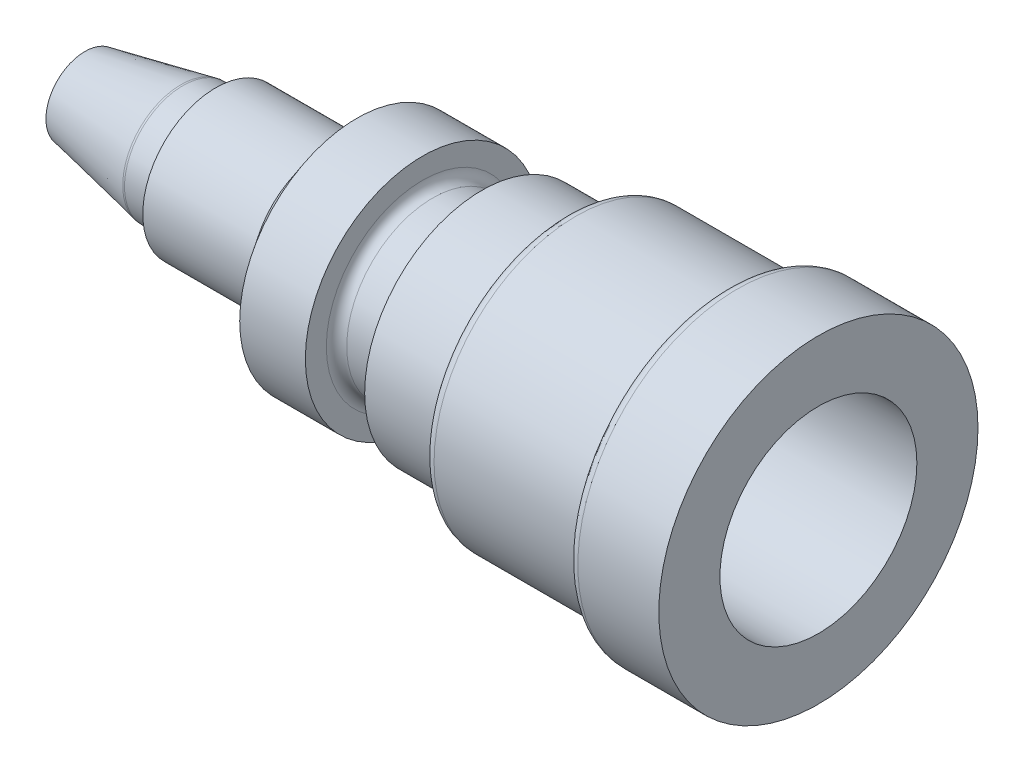
ISO-10303-21;
HEADER;
FILE_DESCRIPTION(('STEP AP214'),'2;1');
FILE_NAME('part.step','',(''),(''),'','','');
FILE_SCHEMA(('AUTOMOTIVE_DESIGN { 1 0 10303 214 1 1 1 1 }'));
ENDSEC;
DATA;
#1=APPLICATION_CONTEXT('core data for automotive mechanical design processes');
#2=APPLICATION_PROTOCOL_DEFINITION('international standard','automotive_design',2000,#1);
#3=PRODUCT_CONTEXT('',#1,'mechanical');
#4=PRODUCT('Part','Part','',(#3));
#5=PRODUCT_RELATED_PRODUCT_CATEGORY('part','',(#4));
#6=PRODUCT_DEFINITION_FORMATION('','',#4);
#7=PRODUCT_DEFINITION_CONTEXT('part definition',#1,'design');
#8=PRODUCT_DEFINITION('design','',#6,#7);
#9=PRODUCT_DEFINITION_SHAPE('','',#8);
#10=(LENGTH_UNIT() NAMED_UNIT(*) SI_UNIT(.MILLI.,.METRE.));
#11=(NAMED_UNIT(*) PLANE_ANGLE_UNIT() SI_UNIT($,.RADIAN.));
#12=(NAMED_UNIT(*) SI_UNIT($,.STERADIAN.) SOLID_ANGLE_UNIT());
#13=UNCERTAINTY_MEASURE_WITH_UNIT(LENGTH_MEASURE(1.E-05),#10,'distance_accuracy_value','');
#14=(GEOMETRIC_REPRESENTATION_CONTEXT(3) GLOBAL_UNCERTAINTY_ASSIGNED_CONTEXT((#13)) GLOBAL_UNIT_ASSIGNED_CONTEXT((#10,
#11,#12)) REPRESENTATION_CONTEXT('',''));
#15=CARTESIAN_POINT('',(0.,0.,0.));
#16=DIRECTION('',(0.,0.,1.));
#17=DIRECTION('',(1.,0.,0.));
#18=AXIS2_PLACEMENT_3D('',#15,#16,#17);
#19=CARTESIAN_POINT('',(-13.0082247191011,0.,-4.37206105171908));
#20=DIRECTION('',(-1.,0.,0.));
#21=DIRECTION('',(0.,0.,1.));
#22=AXIS2_PLACEMENT_3D('',#19,#20,#21);
#23=PLANE('',#22);
#24=CARTESIAN_POINT('',(-13.0082247191011,0.,0.));
#25=DIRECTION('',(1.,0.,0.));
#26=DIRECTION('',(0.,0.,-1.));
#27=AXIS2_PLACEMENT_3D('',#24,#25,#26);
#28=CIRCLE('',#27,4.37206105171908);
#29=CARTESIAN_POINT('',(-13.0082247191011,0.,-4.37206105171908));
#30=VERTEX_POINT('',#29);
#31=EDGE_CURVE('E10',#30,#30,#28,.T.);
#32=ORIENTED_EDGE('',*,*,#31,.T.);
#33=EDGE_LOOP('',(#32));
#34=FACE_BOUND('',#33,.T.);
#35=CARTESIAN_POINT('',(-13.0082247191011,0.,0.));
#36=DIRECTION('',(1.,0.,0.));
#37=DIRECTION('',(0.,0.,-1.));
#38=AXIS2_PLACEMENT_3D('',#35,#36,#37);
#39=CIRCLE('',#38,5.461);
#40=CARTESIAN_POINT('',(-13.0082247191011,0.,-5.461));
#41=VERTEX_POINT('',#40);
#42=EDGE_CURVE('E125',#41,#41,#39,.T.);
#43=ORIENTED_EDGE('',*,*,#42,.F.);
#44=EDGE_LOOP('',(#43));
#45=FACE_BOUND('',#44,.T.);
#46=ADVANCED_FACE('F42',(#34,#45),#23,.T.);
#47=CARTESIAN_POINT('',(32.0676997752809,0.,0.));
#48=DIRECTION('',(1.,0.,0.));
#49=DIRECTION('',(0.,0.,-1.));
#50=AXIS2_PLACEMENT_3D('',#47,#48,#49);
#51=CYLINDRICAL_SURFACE('',#50,4.37206105171908);
#52=CARTESIAN_POINT('',(-15.4629745923401,0.,0.));
#53=DIRECTION('',(1.,0.,0.));
#54=DIRECTION('',(0.,0.,-1.));
#55=AXIS2_PLACEMENT_3D('',#52,#53,#54);
#56=CIRCLE('',#55,4.37206105171908);
#57=CARTESIAN_POINT('',(-15.4629745923401,0.,-4.37206105171908));
#58=VERTEX_POINT('',#57);
#59=EDGE_CURVE('E50',#58,#58,#56,.T.);
#60=ORIENTED_EDGE('',*,*,#59,.T.);
#61=EDGE_LOOP('',(#60));
#62=FACE_BOUND('',#61,.T.);
#63=ORIENTED_EDGE('',*,*,#31,.F.);
#64=EDGE_LOOP('',(#63));
#65=FACE_BOUND('',#64,.T.);
#66=ADVANCED_FACE('F181',(#62,#65),#51,.T.);
#67=CARTESIAN_POINT('',(-15.4629745923401,0.,0.));
#68=DIRECTION('',(1.,0.,0.));
#69=DIRECTION('',(0.,0.,-1.));
#70=AXIS2_PLACEMENT_3D('',#67,#68,#69);
#71=TOROIDAL_SURFACE('',#70,3.61006105171908,0.762);
#72=CARTESIAN_POINT('',(-15.612883129274,0.,0.));
#73=DIRECTION('',(1.,0.,0.));
#74=DIRECTION('',(0.,0.,-1.));
#75=AXIS2_PLACEMENT_3D('',#72,#73,#74);
#76=CIRCLE('',#75,4.3571697657322);
#77=CARTESIAN_POINT('',(-15.612883129274,0.,-4.3571697657322));
#78=VERTEX_POINT('',#77);
#79=EDGE_CURVE('E55',#78,#78,#76,.T.);
#80=ORIENTED_EDGE('',*,*,#79,.T.);
#81=EDGE_LOOP('',(#80));
#82=FACE_BOUND('',#81,.T.);
#83=ORIENTED_EDGE('',*,*,#59,.F.);
#84=EDGE_LOOP('',(#83));
#85=FACE_BOUND('',#84,.T.);
#86=ADVANCED_FACE('F185',(#82,#85),#71,.T.);
#87=CARTESIAN_POINT('',(-15.612883129274,0.,0.));
#88=DIRECTION('',(1.,0.,0.));
#89=DIRECTION('',(0.,0.,-1.));
#90=AXIS2_PLACEMENT_3D('',#87,#88,#89);
#91=CONICAL_SURFACE('',#90,4.3571697657322,0.198021991541968);
#92=CARTESIAN_POINT('',(-22.7963002247191,0.,0.));
#93=DIRECTION('',(1.,0.,0.));
#94=DIRECTION('',(0.,0.,-1.));
#95=AXIS2_PLACEMENT_3D('',#92,#93,#94);
#96=CIRCLE('',#95,2.91580584269664);
#97=CARTESIAN_POINT('',(-22.7963002247191,0.,-2.91580584269664));
#98=VERTEX_POINT('',#97);
#99=EDGE_CURVE('E61',#98,#98,#96,.T.);
#100=ORIENTED_EDGE('',*,*,#99,.T.);
#101=EDGE_LOOP('',(#100));
#102=FACE_BOUND('',#101,.T.);
#103=ORIENTED_EDGE('',*,*,#79,.F.);
#104=EDGE_LOOP('',(#103));
#105=FACE_BOUND('',#104,.T.);
#106=ADVANCED_FACE('F285',(#102,#105),#91,.T.);
#107=CARTESIAN_POINT('',(-22.7963002247191,0.,0.));
#108=DIRECTION('',(-1.,0.,0.));
#109=DIRECTION('',(0.,0.,1.));
#110=AXIS2_PLACEMENT_3D('',#107,#108,#109);
#111=PLANE('',#110);
#112=CARTESIAN_POINT('',(-22.7963002247191,0.,0.));
#113=DIRECTION('',(-1.,0.,0.));
#114=DIRECTION('',(0.,0.,1.));
#115=AXIS2_PLACEMENT_3D('',#112,#113,#114);
#116=CIRCLE('',#115,1.28531594491591);
#117=CARTESIAN_POINT('',(-22.7963002247191,0.,1.2853159449159));
#118=VERTEX_POINT('',#117);
#119=EDGE_CURVE('E137',#118,#118,#116,.T.);
#120=ORIENTED_EDGE('',*,*,#119,.F.);
#121=EDGE_LOOP('',(#120));
#122=FACE_BOUND('',#121,.T.);
#123=ORIENTED_EDGE('',*,*,#99,.F.);
#124=EDGE_LOOP('',(#123));
#125=FACE_BOUND('',#124,.T.);
#126=ADVANCED_FACE('F165',(#122,#125),#111,.T.);
#127=CARTESIAN_POINT('',(32.0676997752809,0.,-11.938));
#128=DIRECTION('',(1.,0.,0.));
#129=DIRECTION('',(0.,0.,-1.));
#130=AXIS2_PLACEMENT_3D('',#127,#128,#129);
#131=PLANE('',#130);
#132=CARTESIAN_POINT('',(32.0676997752809,0.,0.));
#133=DIRECTION('',(1.,0.,0.));
#134=DIRECTION('',(0.,0.,-1.));
#135=AXIS2_PLACEMENT_3D('',#132,#133,#134);
#136=CIRCLE('',#135,7.366);
#137=CARTESIAN_POINT('',(32.0676997752809,0.,-7.366));
#138=VERTEX_POINT('',#137);
#139=EDGE_CURVE('E130',#138,#138,#136,.T.);
#140=ORIENTED_EDGE('',*,*,#139,.F.);
#141=EDGE_LOOP('',(#140));
#142=FACE_BOUND('',#141,.T.);
#143=CARTESIAN_POINT('',(32.0676997752809,0.,0.));
#144=DIRECTION('',(1.,0.,0.));
#145=DIRECTION('',(0.,0.,-1.));
#146=AXIS2_PLACEMENT_3D('',#143,#144,#145);
#147=CIRCLE('',#146,11.938);
#148=CARTESIAN_POINT('',(32.0676997752809,0.,-11.938));
#149=VERTEX_POINT('',#148);
#150=EDGE_CURVE('E65',#149,#149,#147,.T.);
#151=ORIENTED_EDGE('',*,*,#150,.T.);
#152=EDGE_LOOP('',(#151));
#153=FACE_BOUND('',#152,.T.);
#154=ADVANCED_FACE('F161',(#142,#153),#131,.T.);
#155=CARTESIAN_POINT('',(32.0676997752809,0.,0.));
#156=DIRECTION('',(1.,0.,0.));
#157=DIRECTION('',(0.,0.,-1.));
#158=AXIS2_PLACEMENT_3D('',#155,#156,#157);
#159=CYLINDRICAL_SURFACE('',#158,11.938);
#160=CARTESIAN_POINT('',(26.0111818831581,0.,0.));
#161=DIRECTION('',(1.,0.,0.));
#162=DIRECTION('',(0.,0.,-1.));
#163=AXIS2_PLACEMENT_3D('',#160,#161,#162);
#164=CIRCLE('',#163,11.938);
#165=CARTESIAN_POINT('',(26.0111818831581,0.,-11.938));
#166=VERTEX_POINT('',#165);
#167=EDGE_CURVE('E69',#166,#166,#164,.T.);
#168=ORIENTED_EDGE('',*,*,#167,.T.);
#169=EDGE_LOOP('',(#168));
#170=FACE_BOUND('',#169,.T.);
#171=ORIENTED_EDGE('',*,*,#150,.F.);
#172=EDGE_LOOP('',(#171));
#173=FACE_BOUND('',#172,.T.);
#174=ADVANCED_FACE('F164',(#170,#173),#159,.T.);
#175=CARTESIAN_POINT('',(26.0111818831581,0.,0.));
#176=DIRECTION('',(1.,0.,0.));
#177=DIRECTION('',(0.,0.,-1.));
#178=AXIS2_PLACEMENT_3D('',#175,#176,#177);
#179=TOROIDAL_SURFACE('',#178,11.176,0.762);
#180=CARTESIAN_POINT('',(25.2491818831581,0.,0.));
#181=DIRECTION('',(1.,0.,0.));
#182=DIRECTION('',(0.,0.,-1.));
#183=AXIS2_PLACEMENT_3D('',#180,#181,#182);
#184=CIRCLE('',#183,11.176);
#185=CARTESIAN_POINT('',(25.2491818831581,0.,-11.176));
#186=VERTEX_POINT('',#185);
#187=EDGE_CURVE('E73',#186,#186,#184,.T.);
#188=ORIENTED_EDGE('',*,*,#187,.T.);
#189=EDGE_LOOP('',(#188));
#190=FACE_BOUND('',#189,.T.);
#191=ORIENTED_EDGE('',*,*,#167,.F.);
#192=EDGE_LOOP('',(#191));
#193=FACE_BOUND('',#192,.T.);
#194=ADVANCED_FACE('F170',(#190,#193),#179,.T.);
#195=CARTESIAN_POINT('',(25.2491818831581,0.,-10.6235829679029));
#196=DIRECTION('',(-1.,0.,0.));
#197=DIRECTION('',(0.,0.,1.));
#198=AXIS2_PLACEMENT_3D('',#195,#196,#197);
#199=PLANE('',#198);
#200=CARTESIAN_POINT('',(25.2491818831581,0.,0.));
#201=DIRECTION('',(1.,0.,0.));
#202=DIRECTION('',(0.,0.,-1.));
#203=AXIS2_PLACEMENT_3D('',#200,#201,#202);
#204=CIRCLE('',#203,10.6235829679029);
#205=CARTESIAN_POINT('',(25.2491818831581,0.,-10.6235829679029));
#206=VERTEX_POINT('',#205);
#207=EDGE_CURVE('E77',#206,#206,#204,.T.);
#208=ORIENTED_EDGE('',*,*,#207,.T.);
#209=EDGE_LOOP('',(#208));
#210=FACE_BOUND('',#209,.T.);
#211=ORIENTED_EDGE('',*,*,#187,.F.);
#212=EDGE_LOOP('',(#211));
#213=FACE_BOUND('',#212,.T.);
#214=ADVANCED_FACE('F177',(#210,#213),#199,.T.);
#215=CARTESIAN_POINT('',(32.0676997752809,0.,0.));
#216=DIRECTION('',(1.,0.,0.));
#217=DIRECTION('',(0.,0.,-1.));
#218=AXIS2_PLACEMENT_3D('',#215,#216,#217);
#219=CYLINDRICAL_SURFACE('',#218,10.6235829679029);
#220=CARTESIAN_POINT('',(13.9443017202565,0.,0.));
#221=DIRECTION('',(1.,0.,0.));
#222=DIRECTION('',(0.,0.,-1.));
#223=AXIS2_PLACEMENT_3D('',#220,#221,#222);
#224=CIRCLE('',#223,10.6235829679029);
#225=CARTESIAN_POINT('',(13.9443017202565,0.,-10.6235829679029));
#226=VERTEX_POINT('',#225);
#227=EDGE_CURVE('E81',#226,#226,#224,.T.);
#228=ORIENTED_EDGE('',*,*,#227,.T.);
#229=EDGE_LOOP('',(#228));
#230=FACE_BOUND('',#229,.T.);
#231=ORIENTED_EDGE('',*,*,#207,.F.);
#232=EDGE_LOOP('',(#231));
#233=FACE_BOUND('',#232,.T.);
#234=ADVANCED_FACE('F252',(#230,#233),#219,.T.);
#235=CARTESIAN_POINT('',(13.9443017202565,0.,0.));
#236=DIRECTION('',(1.,0.,0.));
#237=DIRECTION('',(0.,0.,-1.));
#238=AXIS2_PLACEMENT_3D('',#235,#236,#237);
#239=TOROIDAL_SURFACE('',#238,9.86158296790292,0.762000000000001);
#240=CARTESIAN_POINT('',(13.1823017202565,0.,0.));
#241=DIRECTION('',(1.,0.,0.));
#242=DIRECTION('',(0.,0.,-1.));
#243=AXIS2_PLACEMENT_3D('',#240,#241,#242);
#244=CIRCLE('',#243,9.86158296790292);
#245=CARTESIAN_POINT('',(13.1823017202565,0.,-9.86158296790292));
#246=VERTEX_POINT('',#245);
#247=EDGE_CURVE('E85',#246,#246,#244,.T.);
#248=ORIENTED_EDGE('',*,*,#247,.T.);
#249=EDGE_LOOP('',(#248));
#250=FACE_BOUND('',#249,.T.);
#251=ORIENTED_EDGE('',*,*,#227,.F.);
#252=EDGE_LOOP('',(#251));
#253=FACE_BOUND('',#252,.T.);
#254=ADVANCED_FACE('F246',(#250,#253),#239,.T.);
#255=CARTESIAN_POINT('',(13.1823017202565,0.,-8.76299999999998));
#256=DIRECTION('',(-1.,0.,0.));
#257=DIRECTION('',(0.,0.,1.));
#258=AXIS2_PLACEMENT_3D('',#255,#256,#257);
#259=PLANE('',#258);
#260=CARTESIAN_POINT('',(13.1823017202565,0.,0.));
#261=DIRECTION('',(1.,0.,0.));
#262=DIRECTION('',(0.,0.,-1.));
#263=AXIS2_PLACEMENT_3D('',#260,#261,#262);
#264=CIRCLE('',#263,8.76299999999999);
#265=CARTESIAN_POINT('',(13.1823017202565,0.,-8.76299999999998));
#266=VERTEX_POINT('',#265);
#267=EDGE_CURVE('E89',#266,#266,#264,.T.);
#268=ORIENTED_EDGE('',*,*,#267,.T.);
#269=EDGE_LOOP('',(#268));
#270=FACE_BOUND('',#269,.T.);
#271=ORIENTED_EDGE('',*,*,#247,.F.);
#272=EDGE_LOOP('',(#271));
#273=FACE_BOUND('',#272,.T.);
#274=ADVANCED_FACE('F240',(#270,#273),#259,.T.);
#275=CARTESIAN_POINT('',(32.0676997752809,0.,0.));
#276=DIRECTION('',(1.,0.,0.));
#277=DIRECTION('',(0.,0.,-1.));
#278=AXIS2_PLACEMENT_3D('',#275,#276,#277);
#279=CYLINDRICAL_SURFACE('',#278,8.76299999999999);
#280=CARTESIAN_POINT('',(6.89190471910113,0.,0.));
#281=DIRECTION('',(1.,0.,0.));
#282=DIRECTION('',(0.,0.,-1.));
#283=AXIS2_PLACEMENT_3D('',#280,#281,#282);
#284=CIRCLE('',#283,8.76299999999999);
#285=CARTESIAN_POINT('',(6.89190471910113,0.,-8.76299999999998));
#286=VERTEX_POINT('',#285);
#287=EDGE_CURVE('E93',#286,#286,#284,.T.);
#288=ORIENTED_EDGE('',*,*,#287,.T.);
#289=EDGE_LOOP('',(#288));
#290=FACE_BOUND('',#289,.T.);
#291=ORIENTED_EDGE('',*,*,#267,.F.);
#292=EDGE_LOOP('',(#291));
#293=FACE_BOUND('',#292,.T.);
#294=ADVANCED_FACE('F234',(#290,#293),#279,.T.);
#295=CARTESIAN_POINT('',(6.89190471910113,0.,-7.19333707865167));
#296=DIRECTION('',(-1.,0.,0.));
#297=DIRECTION('',(0.,0.,1.));
#298=AXIS2_PLACEMENT_3D('',#295,#296,#297);
#299=PLANE('',#298);
#300=CARTESIAN_POINT('',(6.89190471910113,0.,0.));
#301=DIRECTION('',(1.,0.,0.));
#302=DIRECTION('',(0.,0.,-1.));
#303=AXIS2_PLACEMENT_3D('',#300,#301,#302);
#304=CIRCLE('',#303,7.19333707865168);
#305=CARTESIAN_POINT('',(6.89190471910113,0.,-7.19333707865167));
#306=VERTEX_POINT('',#305);
#307=EDGE_CURVE('E97',#306,#306,#304,.T.);
#308=ORIENTED_EDGE('',*,*,#307,.T.);
#309=EDGE_LOOP('',(#308));
#310=FACE_BOUND('',#309,.T.);
#311=ORIENTED_EDGE('',*,*,#287,.F.);
#312=EDGE_LOOP('',(#311));
#313=FACE_BOUND('',#312,.T.);
#314=ADVANCED_FACE('F228',(#310,#313),#299,.T.);
#315=CARTESIAN_POINT('',(6.12990471910113,0.,0.));
#316=DIRECTION('',(1.,0.,0.));
#317=DIRECTION('',(0.,0.,-1.));
#318=AXIS2_PLACEMENT_3D('',#315,#316,#317);
#319=TOROIDAL_SURFACE('',#318,7.19333707865167,0.762);
#320=CARTESIAN_POINT('',(6.12990471910112,0.,0.));
#321=DIRECTION('',(1.,0.,0.));
#322=DIRECTION('',(0.,0.,-1.));
#323=AXIS2_PLACEMENT_3D('',#320,#321,#322);
#324=CIRCLE('',#323,6.43133707865167);
#325=CARTESIAN_POINT('',(6.12990471910113,0.,-6.43133707865167));
#326=VERTEX_POINT('',#325);
#327=EDGE_CURVE('E101',#326,#326,#324,.T.);
#328=ORIENTED_EDGE('',*,*,#327,.T.);
#329=EDGE_LOOP('',(#328));
#330=FACE_BOUND('',#329,.T.);
#331=ORIENTED_EDGE('',*,*,#307,.F.);
#332=EDGE_LOOP('',(#331));
#333=FACE_BOUND('',#332,.T.);
#334=ADVANCED_FACE('F222',(#330,#333),#319,.F.);
#335=CARTESIAN_POINT('',(32.0676997752809,0.,0.));
#336=DIRECTION('',(1.,0.,0.));
#337=DIRECTION('',(0.,0.,-1.));
#338=AXIS2_PLACEMENT_3D('',#335,#336,#337);
#339=CYLINDRICAL_SURFACE('',#338,6.43133707865167);
#340=CARTESIAN_POINT('',(3.21638202247192,0.,0.));
#341=DIRECTION('',(1.,0.,0.));
#342=DIRECTION('',(0.,0.,-1.));
#343=AXIS2_PLACEMENT_3D('',#340,#341,#342);
#344=CIRCLE('',#343,6.43133707865167);
#345=CARTESIAN_POINT('',(3.21638202247192,0.,-6.43133707865167));
#346=VERTEX_POINT('',#345);
#347=EDGE_CURVE('E105',#346,#346,#344,.T.);
#348=ORIENTED_EDGE('',*,*,#347,.T.);
#349=EDGE_LOOP('',(#348));
#350=FACE_BOUND('',#349,.T.);
#351=ORIENTED_EDGE('',*,*,#327,.F.);
#352=EDGE_LOOP('',(#351));
#353=FACE_BOUND('',#352,.T.);
#354=ADVANCED_FACE('F216',(#350,#353),#339,.T.);
#355=CARTESIAN_POINT('',(3.21638202247192,0.,0.));
#356=DIRECTION('',(1.,0.,0.));
#357=DIRECTION('',(0.,0.,-1.));
#358=AXIS2_PLACEMENT_3D('',#355,#356,#357);
#359=TOROIDAL_SURFACE('',#358,7.19333707865167,0.762);
#360=CARTESIAN_POINT('',(2.45438202247192,0.,0.));
#361=DIRECTION('',(1.,0.,0.));
#362=DIRECTION('',(0.,0.,-1.));
#363=AXIS2_PLACEMENT_3D('',#360,#361,#362);
#364=CIRCLE('',#363,7.19333707865167);
#365=CARTESIAN_POINT('',(2.45438202247192,0.,-7.19333707865167));
#366=VERTEX_POINT('',#365);
#367=EDGE_CURVE('E109',#366,#366,#364,.T.);
#368=ORIENTED_EDGE('',*,*,#367,.T.);
#369=EDGE_LOOP('',(#368));
#370=FACE_BOUND('',#369,.T.);
#371=ORIENTED_EDGE('',*,*,#347,.F.);
#372=EDGE_LOOP('',(#371));
#373=FACE_BOUND('',#372,.T.);
#374=ADVANCED_FACE('F210',(#370,#373),#359,.F.);
#375=CARTESIAN_POINT('',(2.45438202247192,0.,-8.76299999999999));
#376=DIRECTION('',(1.,0.,0.));
#377=DIRECTION('',(0.,0.,-1.));
#378=AXIS2_PLACEMENT_3D('',#375,#376,#377);
#379=PLANE('',#378);
#380=CARTESIAN_POINT('',(2.45438202247192,0.,0.));
#381=DIRECTION('',(1.,0.,0.));
#382=DIRECTION('',(0.,0.,-1.));
#383=AXIS2_PLACEMENT_3D('',#380,#381,#382);
#384=CIRCLE('',#383,8.76299999999999);
#385=CARTESIAN_POINT('',(2.45438202247192,0.,-8.76299999999999));
#386=VERTEX_POINT('',#385);
#387=EDGE_CURVE('E113',#386,#386,#384,.T.);
#388=ORIENTED_EDGE('',*,*,#387,.T.);
#389=EDGE_LOOP('',(#388));
#390=FACE_BOUND('',#389,.T.);
#391=ORIENTED_EDGE('',*,*,#367,.F.);
#392=EDGE_LOOP('',(#391));
#393=FACE_BOUND('',#392,.T.);
#394=ADVANCED_FACE('F204',(#390,#393),#379,.T.);
#395=CARTESIAN_POINT('',(32.0676997752809,0.,0.));
#396=DIRECTION('',(1.,0.,0.));
#397=DIRECTION('',(0.,0.,-1.));
#398=AXIS2_PLACEMENT_3D('',#395,#396,#397);
#399=CYLINDRICAL_SURFACE('',#398,8.76299999999999);
#400=CARTESIAN_POINT('',(-2.45438202247189,0.,0.));
#401=DIRECTION('',(1.,0.,0.));
#402=DIRECTION('',(0.,0.,-1.));
#403=AXIS2_PLACEMENT_3D('',#400,#401,#402);
#404=CIRCLE('',#403,8.76299999999999);
#405=CARTESIAN_POINT('',(-2.45438202247189,0.,-8.76299999999999));
#406=VERTEX_POINT('',#405);
#407=EDGE_CURVE('E117',#406,#406,#404,.T.);
#408=ORIENTED_EDGE('',*,*,#407,.T.);
#409=EDGE_LOOP('',(#408));
#410=FACE_BOUND('',#409,.T.);
#411=ORIENTED_EDGE('',*,*,#387,.F.);
#412=EDGE_LOOP('',(#411));
#413=FACE_BOUND('',#412,.T.);
#414=ADVANCED_FACE('F198',(#410,#413),#399,.T.);
#415=CARTESIAN_POINT('',(-2.45438202247189,0.,0.));
#416=DIRECTION('',(1.,0.,0.));
#417=DIRECTION('',(0.,0.,-1.));
#418=AXIS2_PLACEMENT_3D('',#415,#416,#417);
#419=CONICAL_SURFACE('',#418,8.76299999999999,0.93159596839974);
#420=CARTESIAN_POINT('',(-4.90876404494382,0.,0.));
#421=DIRECTION('',(1.,0.,0.));
#422=DIRECTION('',(0.,0.,-1.));
#423=AXIS2_PLACEMENT_3D('',#420,#421,#422);
#424=CIRCLE('',#423,5.461);
#425=CARTESIAN_POINT('',(-4.90876404494382,0.,-5.461));
#426=VERTEX_POINT('',#425);
#427=EDGE_CURVE('E121',#426,#426,#424,.T.);
#428=ORIENTED_EDGE('',*,*,#427,.T.);
#429=EDGE_LOOP('',(#428));
#430=FACE_BOUND('',#429,.T.);
#431=ORIENTED_EDGE('',*,*,#407,.F.);
#432=EDGE_LOOP('',(#431));
#433=FACE_BOUND('',#432,.T.);
#434=ADVANCED_FACE('F192',(#430,#433),#419,.T.);
#435=CARTESIAN_POINT('',(32.0676997752809,0.,0.));
#436=DIRECTION('',(1.,0.,0.));
#437=DIRECTION('',(0.,0.,-1.));
#438=AXIS2_PLACEMENT_3D('',#435,#436,#437);
#439=CYLINDRICAL_SURFACE('',#438,5.461);
#440=ORIENTED_EDGE('',*,*,#42,.T.);
#441=EDGE_LOOP('',(#440));
#442=FACE_BOUND('',#441,.T.);
#443=ORIENTED_EDGE('',*,*,#427,.F.);
#444=EDGE_LOOP('',(#443));
#445=FACE_BOUND('',#444,.T.);
#446=ADVANCED_FACE('F157',(#442,#445),#439,.T.);
#447=CARTESIAN_POINT('',(19.3676997752809,0.,0.));
#448=DIRECTION('',(1.,0.,0.));
#449=DIRECTION('',(0.,0.,-1.));
#450=AXIS2_PLACEMENT_3D('',#447,#448,#449);
#451=CYLINDRICAL_SURFACE('',#450,7.366);
#452=CARTESIAN_POINT('',(19.3676997752809,0.,0.));
#453=DIRECTION('',(1.,0.,0.));
#454=DIRECTION('',(0.,0.,-1.));
#455=AXIS2_PLACEMENT_3D('',#452,#453,#454);
#456=CIRCLE('',#455,7.366);
#457=CARTESIAN_POINT('',(19.3676997752809,0.,-7.366));
#458=VERTEX_POINT('',#457);
#459=EDGE_CURVE('E129',#458,#458,#456,.T.);
#460=CARTESIAN_POINT('',(19.3676997752809,0.,-7.366));
#461=CARTESIAN_POINT('',(19.4999914419476,0.,-7.366));
#462=CARTESIAN_POINT('',(19.6322831086142,0.,-7.366));
#463=CARTESIAN_POINT('',(19.8968664419476,0.,-7.366));
#464=CARTESIAN_POINT('',(20.0291581086142,0.,-7.366));
#465=CARTESIAN_POINT('',(20.2937414419476,0.,-7.366));
#466=CARTESIAN_POINT('',(20.4260331086142,0.,-7.366));
#467=CARTESIAN_POINT('',(20.6906164419476,0.,-7.366));
#468=CARTESIAN_POINT('',(20.8229081086142,0.,-7.366));
#469=CARTESIAN_POINT('',(21.0874914419476,0.,-7.366));
#470=CARTESIAN_POINT('',(21.2197831086142,0.,-7.366));
#471=CARTESIAN_POINT('',(21.4843664419476,0.,-7.366));
#472=CARTESIAN_POINT('',(21.6166581086142,0.,-7.366));
#473=CARTESIAN_POINT('',(21.8812414419476,0.,-7.366));
#474=CARTESIAN_POINT('',(22.0135331086142,0.,-7.366));
#475=CARTESIAN_POINT('',(22.2781164419476,0.,-7.366));
#476=CARTESIAN_POINT('',(22.4104081086142,0.,-7.366));
#477=CARTESIAN_POINT('',(22.6749914419476,0.,-7.366));
#478=CARTESIAN_POINT('',(22.8072831086142,0.,-7.366));
#479=CARTESIAN_POINT('',(23.0718664419476,0.,-7.366));
#480=CARTESIAN_POINT('',(23.2041581086142,0.,-7.366));
#481=CARTESIAN_POINT('',(23.4687414419476,0.,-7.366));
#482=CARTESIAN_POINT('',(23.6010331086142,0.,-7.366));
#483=CARTESIAN_POINT('',(23.8656164419476,0.,-7.366));
#484=CARTESIAN_POINT('',(23.9979081086142,0.,-7.366));
#485=CARTESIAN_POINT('',(24.2624914419476,0.,-7.366));
#486=CARTESIAN_POINT('',(24.3947831086142,0.,-7.366));
#487=CARTESIAN_POINT('',(24.6593664419476,0.,-7.366));
#488=CARTESIAN_POINT('',(24.7916581086143,0.,-7.366));
#489=CARTESIAN_POINT('',(25.0562414419476,0.,-7.366));
#490=CARTESIAN_POINT('',(25.1885331086142,0.,-7.366));
#491=CARTESIAN_POINT('',(25.4531164419476,0.,-7.366));
#492=CARTESIAN_POINT('',(25.5854081086142,0.,-7.366));
#493=CARTESIAN_POINT('',(25.8499914419476,0.,-7.366));
#494=CARTESIAN_POINT('',(25.9822831086143,0.,-7.366));
#495=CARTESIAN_POINT('',(26.2468664419476,0.,-7.366));
#496=CARTESIAN_POINT('',(26.3791581086142,0.,-7.366));
#497=CARTESIAN_POINT('',(26.6437414419476,0.,-7.366));
#498=CARTESIAN_POINT('',(26.7760331086143,0.,-7.366));
#499=CARTESIAN_POINT('',(27.0406164419476,0.,-7.366));
#500=CARTESIAN_POINT('',(27.1729081086143,0.,-7.366));
#501=CARTESIAN_POINT('',(27.4374914419476,0.,-7.366));
#502=CARTESIAN_POINT('',(27.5697831086142,0.,-7.366));
#503=CARTESIAN_POINT('',(27.8343664419476,0.,-7.366));
#504=CARTESIAN_POINT('',(27.9666581086143,0.,-7.366));
#505=CARTESIAN_POINT('',(28.2312414419476,0.,-7.366));
#506=CARTESIAN_POINT('',(28.3635331086143,0.,-7.366));
#507=CARTESIAN_POINT('',(28.6281164419476,0.,-7.366));
#508=CARTESIAN_POINT('',(28.7604081086143,0.,-7.366));
#509=CARTESIAN_POINT('',(29.0249914419476,0.,-7.366));
#510=CARTESIAN_POINT('',(29.1572831086143,0.,-7.366));
#511=CARTESIAN_POINT('',(29.4218664419476,0.,-7.366));
#512=CARTESIAN_POINT('',(29.5541581086143,0.,-7.366));
#513=CARTESIAN_POINT('',(29.8187414419476,0.,-7.366));
#514=CARTESIAN_POINT('',(29.9510331086143,0.,-7.366));
#515=CARTESIAN_POINT('',(30.2156164419476,0.,-7.366));
#516=CARTESIAN_POINT('',(30.3479081086143,0.,-7.366));
#517=CARTESIAN_POINT('',(30.6124914419476,0.,-7.366));
#518=CARTESIAN_POINT('',(30.7447831086143,0.,-7.366));
#519=CARTESIAN_POINT('',(31.0093664419476,0.,-7.366));
#520=CARTESIAN_POINT('',(31.1416581086143,0.,-7.366));
#521=CARTESIAN_POINT('',(31.4062414419476,0.,-7.366));
#522=CARTESIAN_POINT('',(31.5385331086143,0.,-7.366));
#523=CARTESIAN_POINT('',(31.8031164419476,0.,-7.366));
#524=CARTESIAN_POINT('',(31.9354081086143,0.,-7.366));
#525=CARTESIAN_POINT('',(32.0676997752809,0.,-7.366));
#526=B_SPLINE_CURVE_WITH_KNOTS('',3,(#460,#461,#462,#463,#464,#465,#466,#467,#468,#469,#470,
#471,#472,#473,#474,#475,#476,#477,#478,#479,#480,#481,#482,#483,#484,#485,#486,#487,#488,#489,
#490,#491,#492,#493,#494,#495,#496,#497,#498,#499,#500,#501,#502,#503,#504,#505,#506,#507,#508,
#509,#510,#511,#512,#513,#514,#515,#516,#517,#518,#519,#520,#521,#522,#523,#524,#525),
.UNSPECIFIED.,.F.,.F.,(4,2,2,2,2,2,2,2,2,2,2,2,2,2,2,2,2,2,2,2,2,2,2,2,2,2,2,2,2,2,2,2,4),(0.,
0.396875000000001,0.793750000000003,1.190625,1.5875,1.984375,2.38125,2.778125,3.175,3.571875,
3.96875,4.365625,4.7625,5.159375,5.55625000000001,5.953125,6.35,6.74687500000001,7.14375,
7.54062500000001,7.93750000000001,8.334375,8.73125000000001,9.12812500000001,9.52500000000001,
9.92187500000001,10.31875,10.715625,11.1125,11.509375,11.90625,12.303125,12.7),.UNSPECIFIED.);
#527=EDGE_CURVE('BSEAM151',#458,#138,#526,.T.);
#528=ORIENTED_EDGE('',*,*,#459,.F.);
#529=ORIENTED_EDGE('',*,*,#139,.T.);
#530=ORIENTED_EDGE('',*,*,#527,.T.);
#531=ORIENTED_EDGE('',*,*,#527,.F.);
#532=EDGE_LOOP('',(#528,#530,#529,#531));
#533=FACE_BOUND('',#532,.T.);
#534=ADVANCED_FACE('F151',(#533),#451,.F.);
#535=CARTESIAN_POINT('',(19.3676997752809,0.,0.));
#536=DIRECTION('',(1.,0.,0.));
#537=DIRECTION('',(0.,0.,-1.));
#538=AXIS2_PLACEMENT_3D('',#535,#536,#537);
#539=PLANE('',#538);
#540=CARTESIAN_POINT('',(19.3676997752809,0.,0.));
#541=DIRECTION('',(1.,0.,0.));
#542=DIRECTION('',(0.,0.,-1.));
#543=AXIS2_PLACEMENT_3D('',#540,#541,#542);
#544=CIRCLE('',#543,1.28531594491591);
#545=CARTESIAN_POINT('',(19.3676997752809,0.,-1.2853159449159));
#546=VERTEX_POINT('',#545);
#547=EDGE_CURVE('E45',#546,#546,#544,.T.);
#548=ORIENTED_EDGE('',*,*,#547,.F.);
#549=EDGE_LOOP('',(#548));
#550=FACE_BOUND('',#549,.T.);
#551=ORIENTED_EDGE('',*,*,#459,.T.);
#552=EDGE_LOOP('',(#551));
#553=FACE_BOUND('',#552,.T.);
#554=ADVANCED_FACE('F148',(#550,#553),#539,.T.);
#555=CARTESIAN_POINT('',(32.0676997752809,0.,0.));
#556=DIRECTION('',(-1.,0.,0.));
#557=DIRECTION('',(0.,0.,1.));
#558=AXIS2_PLACEMENT_3D('',#555,#556,#557);
#559=CYLINDRICAL_SURFACE('',#558,1.28531594491591);
#560=ORIENTED_EDGE('',*,*,#547,.T.);
#561=EDGE_LOOP('',(#560));
#562=FACE_BOUND('',#561,.T.);
#563=ORIENTED_EDGE('',*,*,#119,.T.);
#564=EDGE_LOOP('',(#563));
#565=FACE_BOUND('',#564,.T.);
#566=ADVANCED_FACE('F146',(#562,#565),#559,.F.);
#567=CLOSED_SHELL('',(#46,#66,#86,#106,#126,#154,#174,#194,#214,#234,#254,#274,#294,#314,#334,
#354,#374,#394,#414,#434,#446,#534,#554,#566));
#568=MANIFOLD_SOLID_BREP('B2',#567);
#569=ADVANCED_BREP_SHAPE_REPRESENTATION('',(#18,#568),#14);
#570=SHAPE_DEFINITION_REPRESENTATION(#9,#569);
ENDSEC;
END-ISO-10303-21;
